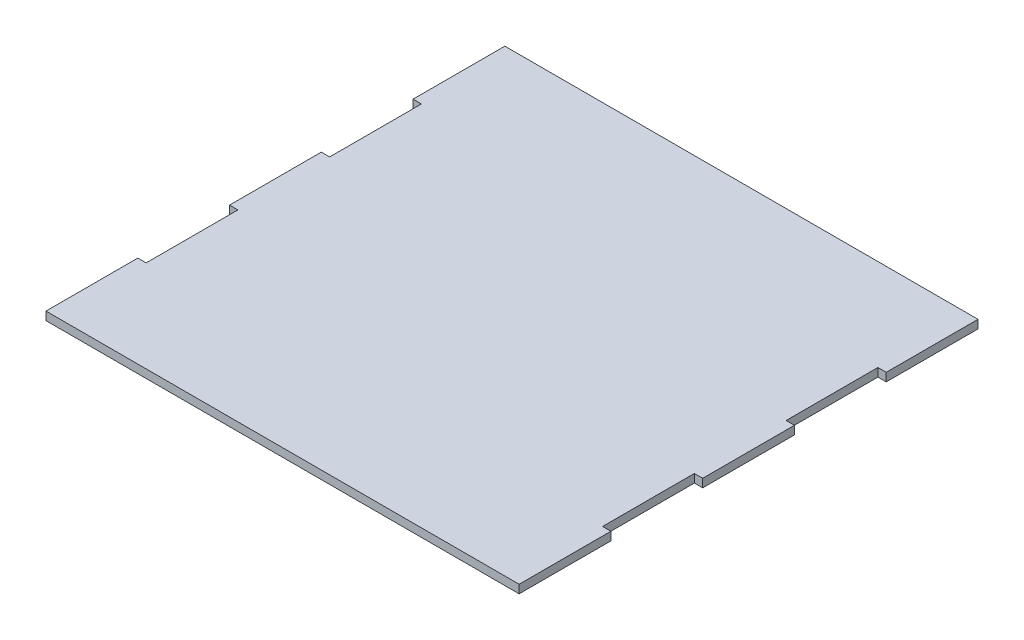
ISO-10303-21;
HEADER;
FILE_DESCRIPTION(('STEP AP214'),'2;1');
FILE_NAME('part.step','',(''),(''),'','','');
FILE_SCHEMA(('AUTOMOTIVE_DESIGN { 1 0 10303 214 1 1 1 1 }'));
ENDSEC;
DATA;
#1=APPLICATION_CONTEXT('core data for automotive mechanical design processes');
#2=APPLICATION_PROTOCOL_DEFINITION('international standard','automotive_design',2000,#1);
#3=PRODUCT_CONTEXT('',#1,'mechanical');
#4=PRODUCT('Part','Part','',(#3));
#5=PRODUCT_RELATED_PRODUCT_CATEGORY('part','',(#4));
#6=PRODUCT_DEFINITION_FORMATION('','',#4);
#7=PRODUCT_DEFINITION_CONTEXT('part definition',#1,'design');
#8=PRODUCT_DEFINITION('design','',#6,#7);
#9=PRODUCT_DEFINITION_SHAPE('','',#8);
#10=(LENGTH_UNIT() NAMED_UNIT(*) SI_UNIT(.MILLI.,.METRE.));
#11=(NAMED_UNIT(*) PLANE_ANGLE_UNIT() SI_UNIT($,.RADIAN.));
#12=(NAMED_UNIT(*) SI_UNIT($,.STERADIAN.) SOLID_ANGLE_UNIT());
#13=UNCERTAINTY_MEASURE_WITH_UNIT(LENGTH_MEASURE(1.E-05),#10,'distance_accuracy_value','');
#14=(GEOMETRIC_REPRESENTATION_CONTEXT(3) GLOBAL_UNCERTAINTY_ASSIGNED_CONTEXT((#13)) GLOBAL_UNIT_ASSIGNED_CONTEXT((#10,
#11,#12)) REPRESENTATION_CONTEXT('',''));
#15=CARTESIAN_POINT('',(0.,0.,0.));
#16=DIRECTION('',(0.,0.,1.));
#17=DIRECTION('',(1.,0.,0.));
#18=AXIS2_PLACEMENT_3D('',#15,#16,#17);
#19=CARTESIAN_POINT('',(-76.7,2.7,-44.631));
#20=DIRECTION('',(1.,0.,0.));
#21=DIRECTION('',(0.,0.,-1.));
#22=AXIS2_PLACEMENT_3D('',#19,#20,#21);
#23=PLANE('',#22);
#24=DIRECTION('',(0.,0.,1.));
#25=VECTOR('',#24,1.);
#26=CARTESIAN_POINT('',(-76.7,0.,-44.631));
#27=LINE('',#26,#25);
#28=CARTESIAN_POINT('',(-76.7,0.,-74.385));
#29=VERTEX_POINT('',#28);
#30=CARTESIAN_POINT('',(-76.7,0.,-44.631));
#31=VERTEX_POINT('',#30);
#32=EDGE_CURVE('E201',#29,#31,#27,.T.);
#33=ORIENTED_EDGE('',*,*,#32,.T.);
#34=DIRECTION('',(0.,-1.,0.));
#35=VECTOR('',#34,1.);
#36=CARTESIAN_POINT('',(-76.7,2.7,-44.631));
#37=LINE('',#36,#35);
#38=CARTESIAN_POINT('',(-76.7,2.7,-44.631));
#39=VERTEX_POINT('',#38);
#40=EDGE_CURVE('E11',#39,#31,#37,.T.);
#41=ORIENTED_EDGE('',*,*,#40,.F.);
#42=DIRECTION('',(0.,0.,1.));
#43=VECTOR('',#42,1.);
#44=CARTESIAN_POINT('',(-76.7,2.7,-44.631));
#45=LINE('',#44,#43);
#46=CARTESIAN_POINT('',(-76.7,2.7,-74.385));
#47=VERTEX_POINT('',#46);
#48=EDGE_CURVE('E239',#47,#39,#45,.T.);
#49=ORIENTED_EDGE('',*,*,#48,.F.);
#50=DIRECTION('',(0.,-1.,0.));
#51=VECTOR('',#50,1.);
#52=CARTESIAN_POINT('',(-76.7,2.7,-74.385));
#53=LINE('',#52,#51);
#54=EDGE_CURVE('E197',#47,#29,#53,.T.);
#55=ORIENTED_EDGE('',*,*,#54,.T.);
#56=EDGE_LOOP('',(#33,#41,#49,#55));
#57=FACE_BOUND('',#56,.T.);
#58=ADVANCED_FACE('F33',(#57),#23,.F.);
#59=CARTESIAN_POINT('',(-76.7,2.7,-44.631));
#60=DIRECTION('',(0.,0.,-1.));
#61=DIRECTION('',(-1.,0.,0.));
#62=AXIS2_PLACEMENT_3D('',#59,#60,#61);
#63=PLANE('',#62);
#64=DIRECTION('',(1.,0.,0.));
#65=VECTOR('',#64,1.);
#66=CARTESIAN_POINT('',(-76.7,0.,-44.631));
#67=LINE('',#66,#65);
#68=CARTESIAN_POINT('',(-74.,0.,-44.631));
#69=VERTEX_POINT('',#68);
#70=EDGE_CURVE('E204',#31,#69,#67,.T.);
#71=ORIENTED_EDGE('',*,*,#70,.T.);
#72=DIRECTION('',(0.,-1.,0.));
#73=VECTOR('',#72,1.);
#74=CARTESIAN_POINT('',(-74.,2.7,-44.631));
#75=LINE('',#74,#73);
#76=CARTESIAN_POINT('',(-74.,2.7,-44.631));
#77=VERTEX_POINT('',#76);
#78=EDGE_CURVE('E41',#77,#69,#75,.T.);
#79=ORIENTED_EDGE('',*,*,#78,.F.);
#80=DIRECTION('',(1.,0.,0.));
#81=VECTOR('',#80,1.);
#82=CARTESIAN_POINT('',(-76.7,2.7,-44.631));
#83=LINE('',#82,#81);
#84=EDGE_CURVE('E128',#39,#77,#83,.T.);
#85=ORIENTED_EDGE('',*,*,#84,.F.);
#86=ORIENTED_EDGE('',*,*,#40,.T.);
#87=EDGE_LOOP('',(#71,#79,#85,#86));
#88=FACE_BOUND('',#87,.T.);
#89=ADVANCED_FACE('F357',(#88),#63,.F.);
#90=CARTESIAN_POINT('',(-74.,2.7,-44.631));
#91=DIRECTION('',(1.,0.,0.));
#92=DIRECTION('',(0.,0.,-1.));
#93=AXIS2_PLACEMENT_3D('',#90,#91,#92);
#94=PLANE('',#93);
#95=DIRECTION('',(0.,0.,1.));
#96=VECTOR('',#95,1.);
#97=CARTESIAN_POINT('',(-74.,0.,-44.631));
#98=LINE('',#97,#96);
#99=CARTESIAN_POINT('',(-74.,0.,-14.877));
#100=VERTEX_POINT('',#99);
#101=EDGE_CURVE('E206',#69,#100,#98,.T.);
#102=ORIENTED_EDGE('',*,*,#101,.T.);
#103=DIRECTION('',(0.,-1.,0.));
#104=VECTOR('',#103,1.);
#105=CARTESIAN_POINT('',(-74.,2.7,-14.877));
#106=LINE('',#105,#104);
#107=CARTESIAN_POINT('',(-74.,2.7,-14.877));
#108=VERTEX_POINT('',#107);
#109=EDGE_CURVE('E282',#108,#100,#106,.T.);
#110=ORIENTED_EDGE('',*,*,#109,.F.);
#111=DIRECTION('',(0.,0.,1.));
#112=VECTOR('',#111,1.);
#113=CARTESIAN_POINT('',(-74.,2.7,-44.631));
#114=LINE('',#113,#112);
#115=EDGE_CURVE('E290',#77,#108,#114,.T.);
#116=ORIENTED_EDGE('',*,*,#115,.F.);
#117=ORIENTED_EDGE('',*,*,#78,.T.);
#118=EDGE_LOOP('',(#102,#110,#116,#117));
#119=FACE_BOUND('',#118,.T.);
#120=ADVANCED_FACE('F288',(#119),#94,.F.);
#121=CARTESIAN_POINT('',(-76.7,2.7,-14.877));
#122=DIRECTION('',(0.,0.,1.));
#123=DIRECTION('',(1.,0.,0.));
#124=AXIS2_PLACEMENT_3D('',#121,#122,#123);
#125=PLANE('',#124);
#126=DIRECTION('',(-1.,0.,0.));
#127=VECTOR('',#126,1.);
#128=CARTESIAN_POINT('',(-76.7,0.,-14.877));
#129=LINE('',#128,#127);
#130=CARTESIAN_POINT('',(-76.7,0.,-14.877));
#131=VERTEX_POINT('',#130);
#132=EDGE_CURVE('E208',#100,#131,#129,.T.);
#133=ORIENTED_EDGE('',*,*,#132,.T.);
#134=DIRECTION('',(0.,-1.,0.));
#135=VECTOR('',#134,1.);
#136=CARTESIAN_POINT('',(-76.7,2.7,-14.877));
#137=LINE('',#136,#135);
#138=CARTESIAN_POINT('',(-76.7,2.7,-14.877));
#139=VERTEX_POINT('',#138);
#140=EDGE_CURVE('E279',#139,#131,#137,.T.);
#141=ORIENTED_EDGE('',*,*,#140,.F.);
#142=DIRECTION('',(-1.,0.,0.));
#143=VECTOR('',#142,1.);
#144=CARTESIAN_POINT('',(-76.7,2.7,-14.877));
#145=LINE('',#144,#143);
#146=EDGE_CURVE('E308',#108,#139,#145,.T.);
#147=ORIENTED_EDGE('',*,*,#146,.F.);
#148=ORIENTED_EDGE('',*,*,#109,.T.);
#149=EDGE_LOOP('',(#133,#141,#147,#148));
#150=FACE_BOUND('',#149,.T.);
#151=ADVANCED_FACE('F299',(#150),#125,.F.);
#152=CARTESIAN_POINT('',(-76.7,2.7,14.877));
#153=DIRECTION('',(1.,0.,0.));
#154=DIRECTION('',(0.,0.,-1.));
#155=AXIS2_PLACEMENT_3D('',#152,#153,#154);
#156=PLANE('',#155);
#157=DIRECTION('',(0.,0.,1.));
#158=VECTOR('',#157,1.);
#159=CARTESIAN_POINT('',(-76.7,0.,14.877));
#160=LINE('',#159,#158);
#161=CARTESIAN_POINT('',(-76.7,0.,14.877));
#162=VERTEX_POINT('',#161);
#163=EDGE_CURVE('E210',#131,#162,#160,.T.);
#164=ORIENTED_EDGE('',*,*,#163,.T.);
#165=DIRECTION('',(0.,-1.,0.));
#166=VECTOR('',#165,1.);
#167=CARTESIAN_POINT('',(-76.7,2.7,14.877));
#168=LINE('',#167,#166);
#169=CARTESIAN_POINT('',(-76.7,2.7,14.877));
#170=VERTEX_POINT('',#169);
#171=EDGE_CURVE('E276',#170,#162,#168,.T.);
#172=ORIENTED_EDGE('',*,*,#171,.F.);
#173=DIRECTION('',(0.,0.,1.));
#174=VECTOR('',#173,1.);
#175=CARTESIAN_POINT('',(-76.7,2.7,14.877));
#176=LINE('',#175,#174);
#177=EDGE_CURVE('E305',#139,#170,#176,.T.);
#178=ORIENTED_EDGE('',*,*,#177,.F.);
#179=ORIENTED_EDGE('',*,*,#140,.T.);
#180=EDGE_LOOP('',(#164,#172,#178,#179));
#181=FACE_BOUND('',#180,.T.);
#182=ADVANCED_FACE('F303',(#181),#156,.F.);
#183=CARTESIAN_POINT('',(-76.7,2.7,14.877));
#184=DIRECTION('',(0.,0.,-1.));
#185=DIRECTION('',(-1.,0.,0.));
#186=AXIS2_PLACEMENT_3D('',#183,#184,#185);
#187=PLANE('',#186);
#188=DIRECTION('',(1.,0.,0.));
#189=VECTOR('',#188,1.);
#190=CARTESIAN_POINT('',(-76.7,0.,14.877));
#191=LINE('',#190,#189);
#192=CARTESIAN_POINT('',(-74.,0.,14.877));
#193=VERTEX_POINT('',#192);
#194=EDGE_CURVE('E212',#162,#193,#191,.T.);
#195=ORIENTED_EDGE('',*,*,#194,.T.);
#196=DIRECTION('',(0.,-1.,0.));
#197=VECTOR('',#196,1.);
#198=CARTESIAN_POINT('',(-74.,2.7,14.877));
#199=LINE('',#198,#197);
#200=CARTESIAN_POINT('',(-74.,2.7,14.877));
#201=VERTEX_POINT('',#200);
#202=EDGE_CURVE('E273',#201,#193,#199,.T.);
#203=ORIENTED_EDGE('',*,*,#202,.F.);
#204=DIRECTION('',(1.,0.,0.));
#205=VECTOR('',#204,1.);
#206=CARTESIAN_POINT('',(-76.7,2.7,14.877));
#207=LINE('',#206,#205);
#208=EDGE_CURVE('E307',#170,#201,#207,.T.);
#209=ORIENTED_EDGE('',*,*,#208,.F.);
#210=ORIENTED_EDGE('',*,*,#171,.T.);
#211=EDGE_LOOP('',(#195,#203,#209,#210));
#212=FACE_BOUND('',#211,.T.);
#213=ADVANCED_FACE('F370',(#212),#187,.F.);
#214=CARTESIAN_POINT('',(-74.,2.7,14.877));
#215=DIRECTION('',(1.,0.,0.));
#216=DIRECTION('',(0.,0.,-1.));
#217=AXIS2_PLACEMENT_3D('',#214,#215,#216);
#218=PLANE('',#217);
#219=DIRECTION('',(0.,0.,1.));
#220=VECTOR('',#219,1.);
#221=CARTESIAN_POINT('',(-74.,0.,14.877));
#222=LINE('',#221,#220);
#223=CARTESIAN_POINT('',(-74.,0.,44.631));
#224=VERTEX_POINT('',#223);
#225=EDGE_CURVE('E214',#193,#224,#222,.T.);
#226=ORIENTED_EDGE('',*,*,#225,.T.);
#227=DIRECTION('',(0.,-1.,0.));
#228=VECTOR('',#227,1.);
#229=CARTESIAN_POINT('',(-74.,2.7,44.631));
#230=LINE('',#229,#228);
#231=CARTESIAN_POINT('',(-74.,2.7,44.631));
#232=VERTEX_POINT('',#231);
#233=EDGE_CURVE('E270',#232,#224,#230,.T.);
#234=ORIENTED_EDGE('',*,*,#233,.F.);
#235=DIRECTION('',(0.,0.,1.));
#236=VECTOR('',#235,1.);
#237=CARTESIAN_POINT('',(-74.,2.7,14.877));
#238=LINE('',#237,#236);
#239=EDGE_CURVE('E310',#201,#232,#238,.T.);
#240=ORIENTED_EDGE('',*,*,#239,.F.);
#241=ORIENTED_EDGE('',*,*,#202,.T.);
#242=EDGE_LOOP('',(#226,#234,#240,#241));
#243=FACE_BOUND('',#242,.T.);
#244=ADVANCED_FACE('F373',(#243),#218,.F.);
#245=CARTESIAN_POINT('',(-76.7,2.7,44.631));
#246=DIRECTION('',(0.,0.,1.));
#247=DIRECTION('',(1.,0.,0.));
#248=AXIS2_PLACEMENT_3D('',#245,#246,#247);
#249=PLANE('',#248);
#250=DIRECTION('',(-1.,0.,0.));
#251=VECTOR('',#250,1.);
#252=CARTESIAN_POINT('',(-76.7,0.,44.631));
#253=LINE('',#252,#251);
#254=CARTESIAN_POINT('',(-76.7,0.,44.631));
#255=VERTEX_POINT('',#254);
#256=EDGE_CURVE('E216',#224,#255,#253,.T.);
#257=ORIENTED_EDGE('',*,*,#256,.T.);
#258=DIRECTION('',(0.,-1.,0.));
#259=VECTOR('',#258,1.);
#260=CARTESIAN_POINT('',(-76.7,2.7,44.631));
#261=LINE('',#260,#259);
#262=CARTESIAN_POINT('',(-76.7,2.7,44.631));
#263=VERTEX_POINT('',#262);
#264=EDGE_CURVE('E267',#263,#255,#261,.T.);
#265=ORIENTED_EDGE('',*,*,#264,.F.);
#266=DIRECTION('',(-1.,0.,0.));
#267=VECTOR('',#266,1.);
#268=CARTESIAN_POINT('',(-76.7,2.7,44.631));
#269=LINE('',#268,#267);
#270=EDGE_CURVE('E316',#232,#263,#269,.T.);
#271=ORIENTED_EDGE('',*,*,#270,.F.);
#272=ORIENTED_EDGE('',*,*,#233,.T.);
#273=EDGE_LOOP('',(#257,#265,#271,#272));
#274=FACE_BOUND('',#273,.T.);
#275=ADVANCED_FACE('F377',(#274),#249,.F.);
#276=CARTESIAN_POINT('',(-76.7,2.7,74.385));
#277=DIRECTION('',(1.,0.,0.));
#278=DIRECTION('',(0.,0.,-1.));
#279=AXIS2_PLACEMENT_3D('',#276,#277,#278);
#280=PLANE('',#279);
#281=DIRECTION('',(0.,0.,1.));
#282=VECTOR('',#281,1.);
#283=CARTESIAN_POINT('',(-76.7,0.,74.385));
#284=LINE('',#283,#282);
#285=CARTESIAN_POINT('',(-76.7,0.,74.385));
#286=VERTEX_POINT('',#285);
#287=EDGE_CURVE('E218',#255,#286,#284,.T.);
#288=ORIENTED_EDGE('',*,*,#287,.T.);
#289=DIRECTION('',(0.,-1.,0.));
#290=VECTOR('',#289,1.);
#291=CARTESIAN_POINT('',(-76.7,2.7,74.385));
#292=LINE('',#291,#290);
#293=CARTESIAN_POINT('',(-76.7,2.7,74.385));
#294=VERTEX_POINT('',#293);
#295=EDGE_CURVE('E264',#294,#286,#292,.T.);
#296=ORIENTED_EDGE('',*,*,#295,.F.);
#297=DIRECTION('',(0.,0.,1.));
#298=VECTOR('',#297,1.);
#299=CARTESIAN_POINT('',(-76.7,2.7,74.385));
#300=LINE('',#299,#298);
#301=EDGE_CURVE('E318',#263,#294,#300,.T.);
#302=ORIENTED_EDGE('',*,*,#301,.F.);
#303=ORIENTED_EDGE('',*,*,#264,.T.);
#304=EDGE_LOOP('',(#288,#296,#302,#303));
#305=FACE_BOUND('',#304,.T.);
#306=ADVANCED_FACE('F381',(#305),#280,.F.);
#307=CARTESIAN_POINT('',(76.7,2.7,74.385));
#308=DIRECTION('',(0.,0.,-1.));
#309=DIRECTION('',(-1.,0.,0.));
#310=AXIS2_PLACEMENT_3D('',#307,#308,#309);
#311=PLANE('',#310);
#312=DIRECTION('',(1.,0.,0.));
#313=VECTOR('',#312,1.);
#314=CARTESIAN_POINT('',(76.7,0.,74.385));
#315=LINE('',#314,#313);
#316=CARTESIAN_POINT('',(76.7,0.,74.385));
#317=VERTEX_POINT('',#316);
#318=EDGE_CURVE('E220',#286,#317,#315,.T.);
#319=ORIENTED_EDGE('',*,*,#318,.T.);
#320=DIRECTION('',(0.,-1.,0.));
#321=VECTOR('',#320,1.);
#322=CARTESIAN_POINT('',(76.7,2.7,74.385));
#323=LINE('',#322,#321);
#324=CARTESIAN_POINT('',(76.7,2.7,74.385));
#325=VERTEX_POINT('',#324);
#326=EDGE_CURVE('E261',#325,#317,#323,.T.);
#327=ORIENTED_EDGE('',*,*,#326,.F.);
#328=DIRECTION('',(1.,0.,0.));
#329=VECTOR('',#328,1.);
#330=CARTESIAN_POINT('',(76.7,2.7,74.385));
#331=LINE('',#330,#329);
#332=EDGE_CURVE('E320',#294,#325,#331,.T.);
#333=ORIENTED_EDGE('',*,*,#332,.F.);
#334=ORIENTED_EDGE('',*,*,#295,.T.);
#335=EDGE_LOOP('',(#319,#327,#333,#334));
#336=FACE_BOUND('',#335,.T.);
#337=ADVANCED_FACE('F385',(#336),#311,.F.);
#338=CARTESIAN_POINT('',(76.7,2.7,74.385));
#339=DIRECTION('',(-1.,0.,0.));
#340=DIRECTION('',(0.,0.,1.));
#341=AXIS2_PLACEMENT_3D('',#338,#339,#340);
#342=PLANE('',#341);
#343=DIRECTION('',(0.,0.,-1.));
#344=VECTOR('',#343,1.);
#345=CARTESIAN_POINT('',(76.7,0.,74.385));
#346=LINE('',#345,#344);
#347=CARTESIAN_POINT('',(76.7,0.,44.631));
#348=VERTEX_POINT('',#347);
#349=EDGE_CURVE('E222',#317,#348,#346,.T.);
#350=ORIENTED_EDGE('',*,*,#349,.T.);
#351=DIRECTION('',(0.,-1.,0.));
#352=VECTOR('',#351,1.);
#353=CARTESIAN_POINT('',(76.7,2.7,44.631));
#354=LINE('',#353,#352);
#355=CARTESIAN_POINT('',(76.7,2.7,44.631));
#356=VERTEX_POINT('',#355);
#357=EDGE_CURVE('E258',#356,#348,#354,.T.);
#358=ORIENTED_EDGE('',*,*,#357,.F.);
#359=DIRECTION('',(0.,0.,-1.));
#360=VECTOR('',#359,1.);
#361=CARTESIAN_POINT('',(76.7,2.7,74.385));
#362=LINE('',#361,#360);
#363=EDGE_CURVE('E322',#325,#356,#362,.T.);
#364=ORIENTED_EDGE('',*,*,#363,.F.);
#365=ORIENTED_EDGE('',*,*,#326,.T.);
#366=EDGE_LOOP('',(#350,#358,#364,#365));
#367=FACE_BOUND('',#366,.T.);
#368=ADVANCED_FACE('F389',(#367),#342,.F.);
#369=CARTESIAN_POINT('',(76.7,2.7,44.631));
#370=DIRECTION('',(0.,0.,1.));
#371=DIRECTION('',(1.,0.,0.));
#372=AXIS2_PLACEMENT_3D('',#369,#370,#371);
#373=PLANE('',#372);
#374=DIRECTION('',(-1.,0.,0.));
#375=VECTOR('',#374,1.);
#376=CARTESIAN_POINT('',(76.7,0.,44.631));
#377=LINE('',#376,#375);
#378=CARTESIAN_POINT('',(74.,0.,44.631));
#379=VERTEX_POINT('',#378);
#380=EDGE_CURVE('E224',#348,#379,#377,.T.);
#381=ORIENTED_EDGE('',*,*,#380,.T.);
#382=DIRECTION('',(0.,-1.,0.));
#383=VECTOR('',#382,1.);
#384=CARTESIAN_POINT('',(74.,2.7,44.631));
#385=LINE('',#384,#383);
#386=CARTESIAN_POINT('',(74.,2.7,44.631));
#387=VERTEX_POINT('',#386);
#388=EDGE_CURVE('E255',#387,#379,#385,.T.);
#389=ORIENTED_EDGE('',*,*,#388,.F.);
#390=DIRECTION('',(-1.,0.,0.));
#391=VECTOR('',#390,1.);
#392=CARTESIAN_POINT('',(76.7,2.7,44.631));
#393=LINE('',#392,#391);
#394=EDGE_CURVE('E324',#356,#387,#393,.T.);
#395=ORIENTED_EDGE('',*,*,#394,.F.);
#396=ORIENTED_EDGE('',*,*,#357,.T.);
#397=EDGE_LOOP('',(#381,#389,#395,#396));
#398=FACE_BOUND('',#397,.T.);
#399=ADVANCED_FACE('F393',(#398),#373,.F.);
#400=CARTESIAN_POINT('',(74.,2.7,14.877));
#401=DIRECTION('',(-1.,0.,0.));
#402=DIRECTION('',(0.,0.,1.));
#403=AXIS2_PLACEMENT_3D('',#400,#401,#402);
#404=PLANE('',#403);
#405=DIRECTION('',(0.,0.,-1.));
#406=VECTOR('',#405,1.);
#407=CARTESIAN_POINT('',(74.,0.,14.877));
#408=LINE('',#407,#406);
#409=CARTESIAN_POINT('',(74.,0.,14.877));
#410=VERTEX_POINT('',#409);
#411=EDGE_CURVE('E226',#379,#410,#408,.T.);
#412=ORIENTED_EDGE('',*,*,#411,.T.);
#413=DIRECTION('',(0.,-1.,0.));
#414=VECTOR('',#413,1.);
#415=CARTESIAN_POINT('',(74.,2.7,14.877));
#416=LINE('',#415,#414);
#417=CARTESIAN_POINT('',(74.,2.7,14.877));
#418=VERTEX_POINT('',#417);
#419=EDGE_CURVE('E252',#418,#410,#416,.T.);
#420=ORIENTED_EDGE('',*,*,#419,.F.);
#421=DIRECTION('',(0.,0.,-1.));
#422=VECTOR('',#421,1.);
#423=CARTESIAN_POINT('',(74.,2.7,14.877));
#424=LINE('',#423,#422);
#425=EDGE_CURVE('E326',#387,#418,#424,.T.);
#426=ORIENTED_EDGE('',*,*,#425,.F.);
#427=ORIENTED_EDGE('',*,*,#388,.T.);
#428=EDGE_LOOP('',(#412,#420,#426,#427));
#429=FACE_BOUND('',#428,.T.);
#430=ADVANCED_FACE('F397',(#429),#404,.F.);
#431=CARTESIAN_POINT('',(76.7,2.7,14.877));
#432=DIRECTION('',(0.,0.,-1.));
#433=DIRECTION('',(-1.,0.,0.));
#434=AXIS2_PLACEMENT_3D('',#431,#432,#433);
#435=PLANE('',#434);
#436=DIRECTION('',(1.,0.,0.));
#437=VECTOR('',#436,1.);
#438=CARTESIAN_POINT('',(76.7,0.,14.877));
#439=LINE('',#438,#437);
#440=CARTESIAN_POINT('',(76.7,0.,14.877));
#441=VERTEX_POINT('',#440);
#442=EDGE_CURVE('E228',#410,#441,#439,.T.);
#443=ORIENTED_EDGE('',*,*,#442,.T.);
#444=DIRECTION('',(0.,-1.,0.));
#445=VECTOR('',#444,1.);
#446=CARTESIAN_POINT('',(76.7,2.7,14.877));
#447=LINE('',#446,#445);
#448=CARTESIAN_POINT('',(76.7,2.7,14.877));
#449=VERTEX_POINT('',#448);
#450=EDGE_CURVE('E249',#449,#441,#447,.T.);
#451=ORIENTED_EDGE('',*,*,#450,.F.);
#452=DIRECTION('',(1.,0.,0.));
#453=VECTOR('',#452,1.);
#454=CARTESIAN_POINT('',(76.7,2.7,14.877));
#455=LINE('',#454,#453);
#456=EDGE_CURVE('E328',#418,#449,#455,.T.);
#457=ORIENTED_EDGE('',*,*,#456,.F.);
#458=ORIENTED_EDGE('',*,*,#419,.T.);
#459=EDGE_LOOP('',(#443,#451,#457,#458));
#460=FACE_BOUND('',#459,.T.);
#461=ADVANCED_FACE('F401',(#460),#435,.F.);
#462=CARTESIAN_POINT('',(76.7,2.7,14.877));
#463=DIRECTION('',(-1.,0.,0.));
#464=DIRECTION('',(0.,0.,1.));
#465=AXIS2_PLACEMENT_3D('',#462,#463,#464);
#466=PLANE('',#465);
#467=DIRECTION('',(0.,0.,-1.));
#468=VECTOR('',#467,1.);
#469=CARTESIAN_POINT('',(76.7,0.,14.877));
#470=LINE('',#469,#468);
#471=CARTESIAN_POINT('',(76.7,0.,-14.877));
#472=VERTEX_POINT('',#471);
#473=EDGE_CURVE('E230',#441,#472,#470,.T.);
#474=ORIENTED_EDGE('',*,*,#473,.T.);
#475=DIRECTION('',(0.,-1.,0.));
#476=VECTOR('',#475,1.);
#477=CARTESIAN_POINT('',(76.7,2.7,-14.877));
#478=LINE('',#477,#476);
#479=CARTESIAN_POINT('',(76.7,2.7,-14.877));
#480=VERTEX_POINT('',#479);
#481=EDGE_CURVE('E246',#480,#472,#478,.T.);
#482=ORIENTED_EDGE('',*,*,#481,.F.);
#483=DIRECTION('',(0.,0.,-1.));
#484=VECTOR('',#483,1.);
#485=CARTESIAN_POINT('',(76.7,2.7,14.877));
#486=LINE('',#485,#484);
#487=EDGE_CURVE('E330',#449,#480,#486,.T.);
#488=ORIENTED_EDGE('',*,*,#487,.F.);
#489=ORIENTED_EDGE('',*,*,#450,.T.);
#490=EDGE_LOOP('',(#474,#482,#488,#489));
#491=FACE_BOUND('',#490,.T.);
#492=ADVANCED_FACE('F405',(#491),#466,.F.);
#493=CARTESIAN_POINT('',(76.7,2.7,-14.877));
#494=DIRECTION('',(0.,0.,1.));
#495=DIRECTION('',(1.,0.,0.));
#496=AXIS2_PLACEMENT_3D('',#493,#494,#495);
#497=PLANE('',#496);
#498=DIRECTION('',(-1.,0.,0.));
#499=VECTOR('',#498,1.);
#500=CARTESIAN_POINT('',(76.7,0.,-14.877));
#501=LINE('',#500,#499);
#502=CARTESIAN_POINT('',(74.,0.,-14.877));
#503=VERTEX_POINT('',#502);
#504=EDGE_CURVE('E232',#472,#503,#501,.T.);
#505=ORIENTED_EDGE('',*,*,#504,.T.);
#506=DIRECTION('',(0.,-1.,0.));
#507=VECTOR('',#506,1.);
#508=CARTESIAN_POINT('',(74.,2.7,-14.877));
#509=LINE('',#508,#507);
#510=CARTESIAN_POINT('',(74.,2.7,-14.877));
#511=VERTEX_POINT('',#510);
#512=EDGE_CURVE('E243',#511,#503,#509,.T.);
#513=ORIENTED_EDGE('',*,*,#512,.F.);
#514=DIRECTION('',(-1.,0.,0.));
#515=VECTOR('',#514,1.);
#516=CARTESIAN_POINT('',(76.7,2.7,-14.877));
#517=LINE('',#516,#515);
#518=EDGE_CURVE('E332',#480,#511,#517,.T.);
#519=ORIENTED_EDGE('',*,*,#518,.F.);
#520=ORIENTED_EDGE('',*,*,#481,.T.);
#521=EDGE_LOOP('',(#505,#513,#519,#520));
#522=FACE_BOUND('',#521,.T.);
#523=ADVANCED_FACE('F338',(#522),#497,.F.);
#524=CARTESIAN_POINT('',(74.,2.7,-44.631));
#525=DIRECTION('',(-1.,0.,0.));
#526=DIRECTION('',(0.,0.,1.));
#527=AXIS2_PLACEMENT_3D('',#524,#525,#526);
#528=PLANE('',#527);
#529=DIRECTION('',(0.,0.,-1.));
#530=VECTOR('',#529,1.);
#531=CARTESIAN_POINT('',(74.,0.,-44.631));
#532=LINE('',#531,#530);
#533=CARTESIAN_POINT('',(74.,0.,-44.631));
#534=VERTEX_POINT('',#533);
#535=EDGE_CURVE('E234',#503,#534,#532,.T.);
#536=ORIENTED_EDGE('',*,*,#535,.T.);
#537=DIRECTION('',(0.,-1.,0.));
#538=VECTOR('',#537,1.);
#539=CARTESIAN_POINT('',(74.,2.7,-44.631));
#540=LINE('',#539,#538);
#541=CARTESIAN_POINT('',(74.,2.7,-44.631));
#542=VERTEX_POINT('',#541);
#543=EDGE_CURVE('E192',#542,#534,#540,.T.);
#544=ORIENTED_EDGE('',*,*,#543,.F.);
#545=DIRECTION('',(0.,0.,-1.));
#546=VECTOR('',#545,1.);
#547=CARTESIAN_POINT('',(74.,2.7,-44.631));
#548=LINE('',#547,#546);
#549=EDGE_CURVE('E183',#511,#542,#548,.T.);
#550=ORIENTED_EDGE('',*,*,#549,.F.);
#551=ORIENTED_EDGE('',*,*,#512,.T.);
#552=EDGE_LOOP('',(#536,#544,#550,#551));
#553=FACE_BOUND('',#552,.T.);
#554=ADVANCED_FACE('F342',(#553),#528,.F.);
#555=CARTESIAN_POINT('',(76.7,2.7,-44.631));
#556=DIRECTION('',(0.,0.,-1.));
#557=DIRECTION('',(-1.,0.,0.));
#558=AXIS2_PLACEMENT_3D('',#555,#556,#557);
#559=PLANE('',#558);
#560=DIRECTION('',(1.,0.,0.));
#561=VECTOR('',#560,1.);
#562=CARTESIAN_POINT('',(76.7,0.,-44.631));
#563=LINE('',#562,#561);
#564=CARTESIAN_POINT('',(76.7,0.,-44.631));
#565=VERTEX_POINT('',#564);
#566=EDGE_CURVE('E191',#534,#565,#563,.T.);
#567=ORIENTED_EDGE('',*,*,#566,.T.);
#568=DIRECTION('',(0.,-1.,0.));
#569=VECTOR('',#568,1.);
#570=CARTESIAN_POINT('',(76.7,2.7,-44.631));
#571=LINE('',#570,#569);
#572=CARTESIAN_POINT('',(76.7,2.7,-44.631));
#573=VERTEX_POINT('',#572);
#574=EDGE_CURVE('E188',#573,#565,#571,.T.);
#575=ORIENTED_EDGE('',*,*,#574,.F.);
#576=DIRECTION('',(1.,0.,0.));
#577=VECTOR('',#576,1.);
#578=CARTESIAN_POINT('',(76.7,2.7,-44.631));
#579=LINE('',#578,#577);
#580=EDGE_CURVE('E177',#542,#573,#579,.T.);
#581=ORIENTED_EDGE('',*,*,#580,.F.);
#582=ORIENTED_EDGE('',*,*,#543,.T.);
#583=EDGE_LOOP('',(#567,#575,#581,#582));
#584=FACE_BOUND('',#583,.T.);
#585=ADVANCED_FACE('F189',(#584),#559,.F.);
#586=CARTESIAN_POINT('',(76.7,2.7,-44.631));
#587=DIRECTION('',(-1.,0.,0.));
#588=DIRECTION('',(0.,0.,1.));
#589=AXIS2_PLACEMENT_3D('',#586,#587,#588);
#590=PLANE('',#589);
#591=DIRECTION('',(0.,0.,-1.));
#592=VECTOR('',#591,1.);
#593=CARTESIAN_POINT('',(76.7,0.,-44.631));
#594=LINE('',#593,#592);
#595=CARTESIAN_POINT('',(76.7,0.,-74.385));
#596=VERTEX_POINT('',#595);
#597=EDGE_CURVE('E114',#565,#596,#594,.T.);
#598=ORIENTED_EDGE('',*,*,#597,.T.);
#599=DIRECTION('',(0.,-1.,0.));
#600=VECTOR('',#599,1.);
#601=CARTESIAN_POINT('',(76.7,2.7,-74.385));
#602=LINE('',#601,#600);
#603=CARTESIAN_POINT('',(76.7,2.7,-74.385));
#604=VERTEX_POINT('',#603);
#605=EDGE_CURVE('E193',#604,#596,#602,.T.);
#606=ORIENTED_EDGE('',*,*,#605,.F.);
#607=DIRECTION('',(0.,0.,-1.));
#608=VECTOR('',#607,1.);
#609=CARTESIAN_POINT('',(76.7,2.7,-44.631));
#610=LINE('',#609,#608);
#611=EDGE_CURVE('E181',#573,#604,#610,.T.);
#612=ORIENTED_EDGE('',*,*,#611,.F.);
#613=ORIENTED_EDGE('',*,*,#574,.T.);
#614=EDGE_LOOP('',(#598,#606,#612,#613));
#615=FACE_BOUND('',#614,.T.);
#616=ADVANCED_FACE('F195',(#615),#590,.F.);
#617=CARTESIAN_POINT('',(76.7,2.7,-74.385));
#618=DIRECTION('',(0.,0.,1.));
#619=DIRECTION('',(1.,0.,0.));
#620=AXIS2_PLACEMENT_3D('',#617,#618,#619);
#621=PLANE('',#620);
#622=DIRECTION('',(-1.,0.,0.));
#623=VECTOR('',#622,1.);
#624=CARTESIAN_POINT('',(76.7,0.,-74.385));
#625=LINE('',#624,#623);
#626=EDGE_CURVE('E120',#596,#29,#625,.T.);
#627=ORIENTED_EDGE('',*,*,#626,.T.);
#628=ORIENTED_EDGE('',*,*,#54,.F.);
#629=DIRECTION('',(-1.,0.,0.));
#630=VECTOR('',#629,1.);
#631=CARTESIAN_POINT('',(76.7,2.7,-74.385));
#632=LINE('',#631,#630);
#633=EDGE_CURVE('E49',#604,#47,#632,.T.);
#634=ORIENTED_EDGE('',*,*,#633,.F.);
#635=ORIENTED_EDGE('',*,*,#605,.T.);
#636=EDGE_LOOP('',(#627,#628,#634,#635));
#637=FACE_BOUND('',#636,.T.);
#638=ADVANCED_FACE('F346',(#637),#621,.F.);
#639=CARTESIAN_POINT('',(0.,2.7,0.));
#640=DIRECTION('',(0.,1.,0.));
#641=DIRECTION('',(0.,0.,1.));
#642=AXIS2_PLACEMENT_3D('',#639,#640,#641);
#643=PLANE('',#642);
#644=ORIENTED_EDGE('',*,*,#48,.T.);
#645=ORIENTED_EDGE('',*,*,#84,.T.);
#646=ORIENTED_EDGE('',*,*,#115,.T.);
#647=ORIENTED_EDGE('',*,*,#146,.T.);
#648=ORIENTED_EDGE('',*,*,#177,.T.);
#649=ORIENTED_EDGE('',*,*,#208,.T.);
#650=ORIENTED_EDGE('',*,*,#239,.T.);
#651=ORIENTED_EDGE('',*,*,#270,.T.);
#652=ORIENTED_EDGE('',*,*,#301,.T.);
#653=ORIENTED_EDGE('',*,*,#332,.T.);
#654=ORIENTED_EDGE('',*,*,#363,.T.);
#655=ORIENTED_EDGE('',*,*,#394,.T.);
#656=ORIENTED_EDGE('',*,*,#425,.T.);
#657=ORIENTED_EDGE('',*,*,#456,.T.);
#658=ORIENTED_EDGE('',*,*,#487,.T.);
#659=ORIENTED_EDGE('',*,*,#518,.T.);
#660=ORIENTED_EDGE('',*,*,#549,.T.);
#661=ORIENTED_EDGE('',*,*,#580,.T.);
#662=ORIENTED_EDGE('',*,*,#611,.T.);
#663=ORIENTED_EDGE('',*,*,#633,.T.);
#664=EDGE_LOOP('',(#644,#645,#646,#647,#648,#649,#650,#651,#652,#653,#654,#655,#656,#657,#658,
#659,#660,#661,#662,#663));
#665=FACE_BOUND('',#664,.T.);
#666=ADVANCED_FACE('F179',(#665),#643,.T.);
#667=CARTESIAN_POINT('',(0.,0.,0.));
#668=DIRECTION('',(0.,1.,0.));
#669=DIRECTION('',(0.,0.,1.));
#670=AXIS2_PLACEMENT_3D('',#667,#668,#669);
#671=PLANE('',#670);
#672=ORIENTED_EDGE('',*,*,#32,.F.);
#673=ORIENTED_EDGE('',*,*,#626,.F.);
#674=ORIENTED_EDGE('',*,*,#597,.F.);
#675=ORIENTED_EDGE('',*,*,#566,.F.);
#676=ORIENTED_EDGE('',*,*,#535,.F.);
#677=ORIENTED_EDGE('',*,*,#504,.F.);
#678=ORIENTED_EDGE('',*,*,#473,.F.);
#679=ORIENTED_EDGE('',*,*,#442,.F.);
#680=ORIENTED_EDGE('',*,*,#411,.F.);
#681=ORIENTED_EDGE('',*,*,#380,.F.);
#682=ORIENTED_EDGE('',*,*,#349,.F.);
#683=ORIENTED_EDGE('',*,*,#318,.F.);
#684=ORIENTED_EDGE('',*,*,#287,.F.);
#685=ORIENTED_EDGE('',*,*,#256,.F.);
#686=ORIENTED_EDGE('',*,*,#225,.F.);
#687=ORIENTED_EDGE('',*,*,#194,.F.);
#688=ORIENTED_EDGE('',*,*,#163,.F.);
#689=ORIENTED_EDGE('',*,*,#132,.F.);
#690=ORIENTED_EDGE('',*,*,#101,.F.);
#691=ORIENTED_EDGE('',*,*,#70,.F.);
#692=EDGE_LOOP('',(#672,#673,#674,#675,#676,#677,#678,#679,#680,#681,#682,#683,#684,#685,#686,
#687,#688,#689,#690,#691));
#693=FACE_BOUND('',#692,.T.);
#694=ADVANCED_FACE('F294',(#693),#671,.F.);
#695=CLOSED_SHELL('',(#58,#89,#120,#151,#182,#213,#244,#275,#306,#337,#368,#399,#430,#461,#492,
#523,#554,#585,#616,#638,#666,#694));
#696=MANIFOLD_SOLID_BREP('B2',#695);
#697=ADVANCED_BREP_SHAPE_REPRESENTATION('',(#18,#696),#14);
#698=SHAPE_DEFINITION_REPRESENTATION(#9,#697);
ENDSEC;
END-ISO-10303-21;
